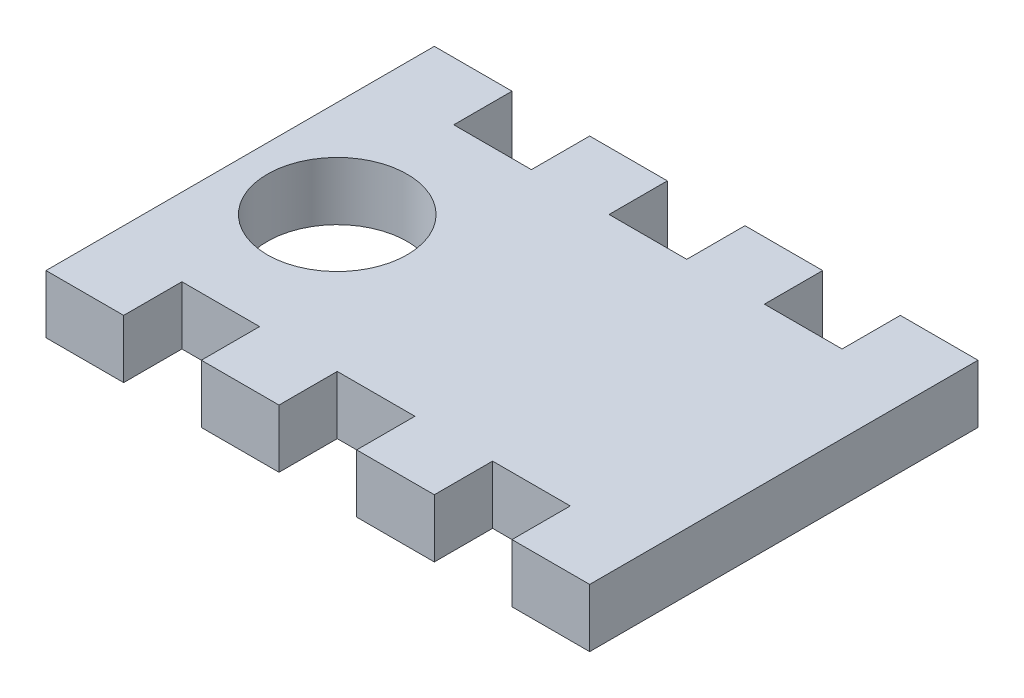
ISO-10303-21;
HEADER;
FILE_DESCRIPTION(('STEP AP214'),'2;1');
FILE_NAME('part.step','',(''),(''),'','','');
FILE_SCHEMA(('AUTOMOTIVE_DESIGN { 1 0 10303 214 1 1 1 1 }'));
ENDSEC;
DATA;
#1=APPLICATION_CONTEXT('core data for automotive mechanical design processes');
#2=APPLICATION_PROTOCOL_DEFINITION('international standard','automotive_design',2000,#1);
#3=PRODUCT_CONTEXT('',#1,'mechanical');
#4=PRODUCT('Part','Part','',(#3));
#5=PRODUCT_RELATED_PRODUCT_CATEGORY('part','',(#4));
#6=PRODUCT_DEFINITION_FORMATION('','',#4);
#7=PRODUCT_DEFINITION_CONTEXT('part definition',#1,'design');
#8=PRODUCT_DEFINITION('design','',#6,#7);
#9=PRODUCT_DEFINITION_SHAPE('','',#8);
#10=(LENGTH_UNIT() NAMED_UNIT(*) SI_UNIT(.MILLI.,.METRE.));
#11=(NAMED_UNIT(*) PLANE_ANGLE_UNIT() SI_UNIT($,.RADIAN.));
#12=(NAMED_UNIT(*) SI_UNIT($,.STERADIAN.) SOLID_ANGLE_UNIT());
#13=UNCERTAINTY_MEASURE_WITH_UNIT(LENGTH_MEASURE(1.E-05),#10,'distance_accuracy_value','');
#14=(GEOMETRIC_REPRESENTATION_CONTEXT(3) GLOBAL_UNCERTAINTY_ASSIGNED_CONTEXT((#13)) GLOBAL_UNIT_ASSIGNED_CONTEXT((#10,
#11,#12)) REPRESENTATION_CONTEXT('',''));
#15=CARTESIAN_POINT('',(0.,0.,0.));
#16=DIRECTION('',(0.,0.,1.));
#17=DIRECTION('',(1.,0.,0.));
#18=AXIS2_PLACEMENT_3D('',#15,#16,#17);
#19=CARTESIAN_POINT('',(0.,3.,7.));
#20=DIRECTION('',(0.,0.,-1.));
#21=DIRECTION('',(-1.,0.,0.));
#22=AXIS2_PLACEMENT_3D('',#19,#20,#21);
#23=PLANE('',#22);
#24=DIRECTION('',(1.,0.,0.));
#25=VECTOR('',#24,1.);
#26=CARTESIAN_POINT('',(0.,3.,7.));
#27=LINE('',#26,#25);
#28=CARTESIAN_POINT('',(-10.,3.,7.));
#29=VERTEX_POINT('',#28);
#30=CARTESIAN_POINT('',(-6.,3.,7.));
#31=VERTEX_POINT('',#30);
#32=EDGE_CURVE('E562',#29,#31,#27,.T.);
#33=ORIENTED_EDGE('',*,*,#32,.F.);
#34=DIRECTION('',(0.,-1.,0.));
#35=VECTOR('',#34,1.);
#36=CARTESIAN_POINT('',(-10.,3.,7.));
#37=LINE('',#36,#35);
#38=CARTESIAN_POINT('',(-10.,0.,7.));
#39=VERTEX_POINT('',#38);
#40=EDGE_CURVE('E12',#29,#39,#37,.T.);
#41=ORIENTED_EDGE('',*,*,#40,.T.);
#42=DIRECTION('',(1.,0.,0.));
#43=VECTOR('',#42,1.);
#44=CARTESIAN_POINT('',(0.,0.,7.));
#45=LINE('',#44,#43);
#46=CARTESIAN_POINT('',(-6.,0.,7.));
#47=VERTEX_POINT('',#46);
#48=EDGE_CURVE('E481',#39,#47,#45,.T.);
#49=ORIENTED_EDGE('',*,*,#48,.T.);
#50=DIRECTION('',(0.,-1.,0.));
#51=VECTOR('',#50,1.);
#52=CARTESIAN_POINT('',(-6.,3.,7.));
#53=LINE('',#52,#51);
#54=EDGE_CURVE('E328',#31,#47,#53,.T.);
#55=ORIENTED_EDGE('',*,*,#54,.F.);
#56=EDGE_LOOP('',(#33,#41,#49,#55));
#57=FACE_BOUND('',#56,.T.);
#58=ADVANCED_FACE('F201',(#57),#23,.F.);
#59=CARTESIAN_POINT('',(-6.00000000000001,3.,0.));
#60=DIRECTION('',(1.,0.,0.));
#61=DIRECTION('',(0.,0.,-1.));
#62=AXIS2_PLACEMENT_3D('',#59,#60,#61);
#63=PLANE('',#62);
#64=DIRECTION('',(0.,0.,1.));
#65=VECTOR('',#64,1.);
#66=CARTESIAN_POINT('',(-6.00000000000001,0.,0.));
#67=LINE('',#66,#65);
#68=CARTESIAN_POINT('',(-5.99999999999999,0.,10.));
#69=VERTEX_POINT('',#68);
#70=EDGE_CURVE('E477',#47,#69,#67,.T.);
#71=ORIENTED_EDGE('',*,*,#70,.T.);
#72=DIRECTION('',(0.,-1.,0.));
#73=VECTOR('',#72,1.);
#74=CARTESIAN_POINT('',(-5.99999999999999,3.,10.));
#75=LINE('',#74,#73);
#76=CARTESIAN_POINT('',(-5.99999999999999,3.,10.));
#77=VERTEX_POINT('',#76);
#78=EDGE_CURVE('E332',#77,#69,#75,.T.);
#79=ORIENTED_EDGE('',*,*,#78,.F.);
#80=DIRECTION('',(0.,0.,1.));
#81=VECTOR('',#80,1.);
#82=CARTESIAN_POINT('',(-6.00000000000001,3.,0.));
#83=LINE('',#82,#81);
#84=EDGE_CURVE('E558',#31,#77,#83,.T.);
#85=ORIENTED_EDGE('',*,*,#84,.F.);
#86=ORIENTED_EDGE('',*,*,#54,.T.);
#87=EDGE_LOOP('',(#71,#79,#85,#86));
#88=FACE_BOUND('',#87,.T.);
#89=ADVANCED_FACE('F647',(#88),#63,.F.);
#90=CARTESIAN_POINT('',(0.,3.,10.));
#91=DIRECTION('',(0.,0.,-1.));
#92=DIRECTION('',(-1.,0.,0.));
#93=AXIS2_PLACEMENT_3D('',#90,#91,#92);
#94=PLANE('',#93);
#95=DIRECTION('',(1.,0.,0.));
#96=VECTOR('',#95,1.);
#97=CARTESIAN_POINT('',(0.,0.,10.));
#98=LINE('',#97,#96);
#99=CARTESIAN_POINT('',(-1.99999999999999,0.,10.));
#100=VERTEX_POINT('',#99);
#101=EDGE_CURVE('E473',#69,#100,#98,.T.);
#102=ORIENTED_EDGE('',*,*,#101,.T.);
#103=DIRECTION('',(0.,-1.,0.));
#104=VECTOR('',#103,1.);
#105=CARTESIAN_POINT('',(-1.99999999999999,3.,10.));
#106=LINE('',#105,#104);
#107=CARTESIAN_POINT('',(-1.99999999999999,3.,10.));
#108=VERTEX_POINT('',#107);
#109=EDGE_CURVE('E336',#108,#100,#106,.T.);
#110=ORIENTED_EDGE('',*,*,#109,.F.);
#111=DIRECTION('',(1.,0.,0.));
#112=VECTOR('',#111,1.);
#113=CARTESIAN_POINT('',(0.,3.,10.));
#114=LINE('',#113,#112);
#115=EDGE_CURVE('E554',#77,#108,#114,.T.);
#116=ORIENTED_EDGE('',*,*,#115,.F.);
#117=ORIENTED_EDGE('',*,*,#78,.T.);
#118=EDGE_LOOP('',(#102,#110,#116,#117));
#119=FACE_BOUND('',#118,.T.);
#120=ADVANCED_FACE('F757',(#119),#94,.F.);
#121=CARTESIAN_POINT('',(-2.00000000000001,3.,0.));
#122=DIRECTION('',(1.,0.,0.));
#123=DIRECTION('',(0.,0.,-1.));
#124=AXIS2_PLACEMENT_3D('',#121,#122,#123);
#125=PLANE('',#124);
#126=DIRECTION('',(0.,0.,1.));
#127=VECTOR('',#126,1.);
#128=CARTESIAN_POINT('',(-2.00000000000001,0.,0.));
#129=LINE('',#128,#127);
#130=CARTESIAN_POINT('',(-2.,0.,7.));
#131=VERTEX_POINT('',#130);
#132=EDGE_CURVE('E469',#131,#100,#129,.T.);
#133=ORIENTED_EDGE('',*,*,#132,.F.);
#134=DIRECTION('',(0.,-1.,0.));
#135=VECTOR('',#134,1.);
#136=CARTESIAN_POINT('',(-2.,3.,7.));
#137=LINE('',#136,#135);
#138=CARTESIAN_POINT('',(-2.,3.,7.));
#139=VERTEX_POINT('',#138);
#140=EDGE_CURVE('E340',#139,#131,#137,.T.);
#141=ORIENTED_EDGE('',*,*,#140,.F.);
#142=DIRECTION('',(0.,0.,1.));
#143=VECTOR('',#142,1.);
#144=CARTESIAN_POINT('',(-2.00000000000001,3.,0.));
#145=LINE('',#144,#143);
#146=EDGE_CURVE('E550',#139,#108,#145,.T.);
#147=ORIENTED_EDGE('',*,*,#146,.T.);
#148=ORIENTED_EDGE('',*,*,#109,.T.);
#149=EDGE_LOOP('',(#133,#141,#147,#148));
#150=FACE_BOUND('',#149,.T.);
#151=ADVANCED_FACE('F760',(#150),#125,.T.);
#152=CARTESIAN_POINT('',(2.,0.,7.));
#153=VERTEX_POINT('',#152);
#154=EDGE_CURVE('E468',#131,#153,#45,.T.);
#155=ORIENTED_EDGE('',*,*,#154,.T.);
#156=DIRECTION('',(0.,-1.,0.));
#157=VECTOR('',#156,1.);
#158=CARTESIAN_POINT('',(2.,3.,7.));
#159=LINE('',#158,#157);
#160=CARTESIAN_POINT('',(2.,3.,7.));
#161=VERTEX_POINT('',#160);
#162=EDGE_CURVE('E344',#161,#153,#159,.T.);
#163=ORIENTED_EDGE('',*,*,#162,.F.);
#164=EDGE_CURVE('E549',#139,#161,#27,.T.);
#165=ORIENTED_EDGE('',*,*,#164,.F.);
#166=ORIENTED_EDGE('',*,*,#140,.T.);
#167=EDGE_LOOP('',(#155,#163,#165,#166));
#168=FACE_BOUND('',#167,.T.);
#169=ADVANCED_FACE('F764',(#168),#23,.F.);
#170=CARTESIAN_POINT('',(1.99999999999999,3.,0.));
#171=DIRECTION('',(1.,0.,0.));
#172=DIRECTION('',(0.,0.,-1.));
#173=AXIS2_PLACEMENT_3D('',#170,#171,#172);
#174=PLANE('',#173);
#175=DIRECTION('',(0.,0.,1.));
#176=VECTOR('',#175,1.);
#177=CARTESIAN_POINT('',(1.99999999999999,0.,0.));
#178=LINE('',#177,#176);
#179=CARTESIAN_POINT('',(2.00000000000001,0.,10.));
#180=VERTEX_POINT('',#179);
#181=EDGE_CURVE('E464',#153,#180,#178,.T.);
#182=ORIENTED_EDGE('',*,*,#181,.T.);
#183=DIRECTION('',(0.,-1.,0.));
#184=VECTOR('',#183,1.);
#185=CARTESIAN_POINT('',(2.00000000000001,3.,10.));
#186=LINE('',#185,#184);
#187=CARTESIAN_POINT('',(2.00000000000001,3.,10.));
#188=VERTEX_POINT('',#187);
#189=EDGE_CURVE('E348',#188,#180,#186,.T.);
#190=ORIENTED_EDGE('',*,*,#189,.F.);
#191=DIRECTION('',(0.,0.,1.));
#192=VECTOR('',#191,1.);
#193=CARTESIAN_POINT('',(1.99999999999999,3.,0.));
#194=LINE('',#193,#192);
#195=EDGE_CURVE('E545',#161,#188,#194,.T.);
#196=ORIENTED_EDGE('',*,*,#195,.F.);
#197=ORIENTED_EDGE('',*,*,#162,.T.);
#198=EDGE_LOOP('',(#182,#190,#196,#197));
#199=FACE_BOUND('',#198,.T.);
#200=ADVANCED_FACE('F766',(#199),#174,.F.);
#201=CARTESIAN_POINT('',(0.,3.,10.));
#202=DIRECTION('',(0.,0.,-1.));
#203=DIRECTION('',(-1.,0.,0.));
#204=AXIS2_PLACEMENT_3D('',#201,#202,#203);
#205=PLANE('',#204);
#206=DIRECTION('',(1.,0.,0.));
#207=VECTOR('',#206,1.);
#208=CARTESIAN_POINT('',(0.,0.,10.));
#209=LINE('',#208,#207);
#210=CARTESIAN_POINT('',(6.00000000000001,0.,10.));
#211=VERTEX_POINT('',#210);
#212=EDGE_CURVE('E460',#180,#211,#209,.T.);
#213=ORIENTED_EDGE('',*,*,#212,.T.);
#214=DIRECTION('',(0.,-1.,0.));
#215=VECTOR('',#214,1.);
#216=CARTESIAN_POINT('',(6.00000000000001,3.,10.));
#217=LINE('',#216,#215);
#218=CARTESIAN_POINT('',(6.00000000000001,3.,10.));
#219=VERTEX_POINT('',#218);
#220=EDGE_CURVE('E352',#219,#211,#217,.T.);
#221=ORIENTED_EDGE('',*,*,#220,.F.);
#222=DIRECTION('',(1.,0.,0.));
#223=VECTOR('',#222,1.);
#224=CARTESIAN_POINT('',(0.,3.,10.));
#225=LINE('',#224,#223);
#226=EDGE_CURVE('E541',#188,#219,#225,.T.);
#227=ORIENTED_EDGE('',*,*,#226,.F.);
#228=ORIENTED_EDGE('',*,*,#189,.T.);
#229=EDGE_LOOP('',(#213,#221,#227,#228));
#230=FACE_BOUND('',#229,.T.);
#231=ADVANCED_FACE('F769',(#230),#205,.F.);
#232=CARTESIAN_POINT('',(5.99999999999999,3.,0.));
#233=DIRECTION('',(1.,0.,0.));
#234=DIRECTION('',(0.,0.,-1.));
#235=AXIS2_PLACEMENT_3D('',#232,#233,#234);
#236=PLANE('',#235);
#237=DIRECTION('',(0.,0.,1.));
#238=VECTOR('',#237,1.);
#239=CARTESIAN_POINT('',(5.99999999999999,0.,0.));
#240=LINE('',#239,#238);
#241=CARTESIAN_POINT('',(6.,0.,7.));
#242=VERTEX_POINT('',#241);
#243=EDGE_CURVE('E456',#242,#211,#240,.T.);
#244=ORIENTED_EDGE('',*,*,#243,.F.);
#245=DIRECTION('',(0.,-1.,0.));
#246=VECTOR('',#245,1.);
#247=CARTESIAN_POINT('',(6.,3.,7.));
#248=LINE('',#247,#246);
#249=CARTESIAN_POINT('',(6.,3.,7.));
#250=VERTEX_POINT('',#249);
#251=EDGE_CURVE('E356',#250,#242,#248,.T.);
#252=ORIENTED_EDGE('',*,*,#251,.F.);
#253=DIRECTION('',(0.,0.,1.));
#254=VECTOR('',#253,1.);
#255=CARTESIAN_POINT('',(5.99999999999999,3.,0.));
#256=LINE('',#255,#254);
#257=EDGE_CURVE('E537',#250,#219,#256,.T.);
#258=ORIENTED_EDGE('',*,*,#257,.T.);
#259=ORIENTED_EDGE('',*,*,#220,.T.);
#260=EDGE_LOOP('',(#244,#252,#258,#259));
#261=FACE_BOUND('',#260,.T.);
#262=ADVANCED_FACE('F773',(#261),#236,.T.);
#263=CARTESIAN_POINT('',(10.,0.,7.));
#264=VERTEX_POINT('',#263);
#265=EDGE_CURVE('E455',#242,#264,#45,.T.);
#266=ORIENTED_EDGE('',*,*,#265,.T.);
#267=DIRECTION('',(0.,-1.,0.));
#268=VECTOR('',#267,1.);
#269=CARTESIAN_POINT('',(10.,3.,7.));
#270=LINE('',#269,#268);
#271=CARTESIAN_POINT('',(10.,3.,7.));
#272=VERTEX_POINT('',#271);
#273=EDGE_CURVE('E360',#272,#264,#270,.T.);
#274=ORIENTED_EDGE('',*,*,#273,.F.);
#275=EDGE_CURVE('E536',#250,#272,#27,.T.);
#276=ORIENTED_EDGE('',*,*,#275,.F.);
#277=ORIENTED_EDGE('',*,*,#251,.T.);
#278=EDGE_LOOP('',(#266,#274,#276,#277));
#279=FACE_BOUND('',#278,.T.);
#280=ADVANCED_FACE('F777',(#279),#23,.F.);
#281=CARTESIAN_POINT('',(9.99999999999999,3.,0.));
#282=DIRECTION('',(1.,0.,0.));
#283=DIRECTION('',(0.,0.,-1.));
#284=AXIS2_PLACEMENT_3D('',#281,#282,#283);
#285=PLANE('',#284);
#286=DIRECTION('',(0.,0.,1.));
#287=VECTOR('',#286,1.);
#288=CARTESIAN_POINT('',(9.99999999999999,0.,0.));
#289=LINE('',#288,#287);
#290=CARTESIAN_POINT('',(10.,0.,10.));
#291=VERTEX_POINT('',#290);
#292=EDGE_CURVE('E451',#264,#291,#289,.T.);
#293=ORIENTED_EDGE('',*,*,#292,.T.);
#294=DIRECTION('',(0.,-1.,0.));
#295=VECTOR('',#294,1.);
#296=CARTESIAN_POINT('',(10.,3.,10.));
#297=LINE('',#296,#295);
#298=CARTESIAN_POINT('',(10.,3.,10.));
#299=VERTEX_POINT('',#298);
#300=EDGE_CURVE('E364',#299,#291,#297,.T.);
#301=ORIENTED_EDGE('',*,*,#300,.F.);
#302=DIRECTION('',(0.,0.,1.));
#303=VECTOR('',#302,1.);
#304=CARTESIAN_POINT('',(9.99999999999999,3.,0.));
#305=LINE('',#304,#303);
#306=EDGE_CURVE('E532',#272,#299,#305,.T.);
#307=ORIENTED_EDGE('',*,*,#306,.F.);
#308=ORIENTED_EDGE('',*,*,#273,.T.);
#309=EDGE_LOOP('',(#293,#301,#307,#308));
#310=FACE_BOUND('',#309,.T.);
#311=ADVANCED_FACE('F781',(#310),#285,.F.);
#312=CARTESIAN_POINT('',(0.,3.,10.));
#313=DIRECTION('',(0.,0.,-1.));
#314=DIRECTION('',(-1.,0.,0.));
#315=AXIS2_PLACEMENT_3D('',#312,#313,#314);
#316=PLANE('',#315);
#317=DIRECTION('',(1.,0.,0.));
#318=VECTOR('',#317,1.);
#319=CARTESIAN_POINT('',(0.,0.,10.));
#320=LINE('',#319,#318);
#321=CARTESIAN_POINT('',(14.,0.,9.99999999999999));
#322=VERTEX_POINT('',#321);
#323=EDGE_CURVE('E447',#291,#322,#320,.T.);
#324=ORIENTED_EDGE('',*,*,#323,.T.);
#325=DIRECTION('',(0.,-1.,0.));
#326=VECTOR('',#325,1.);
#327=CARTESIAN_POINT('',(14.,3.,9.99999999999999));
#328=LINE('',#327,#326);
#329=CARTESIAN_POINT('',(14.,3.,9.99999999999999));
#330=VERTEX_POINT('',#329);
#331=EDGE_CURVE('E368',#330,#322,#328,.T.);
#332=ORIENTED_EDGE('',*,*,#331,.F.);
#333=DIRECTION('',(1.,0.,0.));
#334=VECTOR('',#333,1.);
#335=CARTESIAN_POINT('',(0.,3.,10.));
#336=LINE('',#335,#334);
#337=EDGE_CURVE('E528',#299,#330,#336,.T.);
#338=ORIENTED_EDGE('',*,*,#337,.F.);
#339=ORIENTED_EDGE('',*,*,#300,.T.);
#340=EDGE_LOOP('',(#324,#332,#338,#339));
#341=FACE_BOUND('',#340,.T.);
#342=ADVANCED_FACE('F785',(#341),#316,.F.);
#343=CARTESIAN_POINT('',(14.,3.,0.));
#344=DIRECTION('',(-1.,0.,0.));
#345=DIRECTION('',(0.,0.,1.));
#346=AXIS2_PLACEMENT_3D('',#343,#344,#345);
#347=PLANE('',#346);
#348=DIRECTION('',(0.,0.,-1.));
#349=VECTOR('',#348,1.);
#350=CARTESIAN_POINT('',(14.,0.,0.));
#351=LINE('',#350,#349);
#352=CARTESIAN_POINT('',(14.,0.,-10.));
#353=VERTEX_POINT('',#352);
#354=EDGE_CURVE('E443',#322,#353,#351,.T.);
#355=ORIENTED_EDGE('',*,*,#354,.T.);
#356=DIRECTION('',(0.,-1.,0.));
#357=VECTOR('',#356,1.);
#358=CARTESIAN_POINT('',(14.,3.,-10.));
#359=LINE('',#358,#357);
#360=CARTESIAN_POINT('',(14.,3.,-10.));
#361=VERTEX_POINT('',#360);
#362=EDGE_CURVE('E372',#361,#353,#359,.T.);
#363=ORIENTED_EDGE('',*,*,#362,.F.);
#364=DIRECTION('',(0.,0.,-1.));
#365=VECTOR('',#364,1.);
#366=CARTESIAN_POINT('',(14.,3.,0.));
#367=LINE('',#366,#365);
#368=EDGE_CURVE('E524',#330,#361,#367,.T.);
#369=ORIENTED_EDGE('',*,*,#368,.F.);
#370=ORIENTED_EDGE('',*,*,#331,.T.);
#371=EDGE_LOOP('',(#355,#363,#369,#370));
#372=FACE_BOUND('',#371,.T.);
#373=ADVANCED_FACE('F789',(#372),#347,.F.);
#374=CARTESIAN_POINT('',(0.,3.,-10.));
#375=DIRECTION('',(0.,0.,-1.));
#376=DIRECTION('',(-1.,0.,0.));
#377=AXIS2_PLACEMENT_3D('',#374,#375,#376);
#378=PLANE('',#377);
#379=DIRECTION('',(1.,0.,0.));
#380=VECTOR('',#379,1.);
#381=CARTESIAN_POINT('',(0.,0.,-10.));
#382=LINE('',#381,#380);
#383=CARTESIAN_POINT('',(9.99999999999999,0.,-10.));
#384=VERTEX_POINT('',#383);
#385=EDGE_CURVE('E439',#384,#353,#382,.T.);
#386=ORIENTED_EDGE('',*,*,#385,.F.);
#387=DIRECTION('',(0.,-1.,0.));
#388=VECTOR('',#387,1.);
#389=CARTESIAN_POINT('',(9.99999999999999,3.,-10.));
#390=LINE('',#389,#388);
#391=CARTESIAN_POINT('',(9.99999999999999,3.,-10.));
#392=VERTEX_POINT('',#391);
#393=EDGE_CURVE('E376',#392,#384,#390,.T.);
#394=ORIENTED_EDGE('',*,*,#393,.F.);
#395=DIRECTION('',(1.,0.,0.));
#396=VECTOR('',#395,1.);
#397=CARTESIAN_POINT('',(0.,3.,-10.));
#398=LINE('',#397,#396);
#399=EDGE_CURVE('E520',#392,#361,#398,.T.);
#400=ORIENTED_EDGE('',*,*,#399,.T.);
#401=ORIENTED_EDGE('',*,*,#362,.T.);
#402=EDGE_LOOP('',(#386,#394,#400,#401));
#403=FACE_BOUND('',#402,.T.);
#404=ADVANCED_FACE('F793',(#403),#378,.T.);
#405=CARTESIAN_POINT('',(9.99999999999999,3.,0.));
#406=DIRECTION('',(-1.,0.,0.));
#407=DIRECTION('',(0.,0.,1.));
#408=AXIS2_PLACEMENT_3D('',#405,#406,#407);
#409=PLANE('',#408);
#410=DIRECTION('',(0.,0.,-1.));
#411=VECTOR('',#410,1.);
#412=CARTESIAN_POINT('',(9.99999999999999,0.,0.));
#413=LINE('',#412,#411);
#414=CARTESIAN_POINT('',(9.99999999999999,0.,-7.));
#415=VERTEX_POINT('',#414);
#416=EDGE_CURVE('E435',#415,#384,#413,.T.);
#417=ORIENTED_EDGE('',*,*,#416,.F.);
#418=DIRECTION('',(0.,-1.,0.));
#419=VECTOR('',#418,1.);
#420=CARTESIAN_POINT('',(9.99999999999999,3.,-7.));
#421=LINE('',#420,#419);
#422=CARTESIAN_POINT('',(9.99999999999999,3.,-7.));
#423=VERTEX_POINT('',#422);
#424=EDGE_CURVE('E380',#423,#415,#421,.T.);
#425=ORIENTED_EDGE('',*,*,#424,.F.);
#426=DIRECTION('',(0.,0.,-1.));
#427=VECTOR('',#426,1.);
#428=CARTESIAN_POINT('',(9.99999999999999,3.,0.));
#429=LINE('',#428,#427);
#430=EDGE_CURVE('E516',#423,#392,#429,.T.);
#431=ORIENTED_EDGE('',*,*,#430,.T.);
#432=ORIENTED_EDGE('',*,*,#393,.T.);
#433=EDGE_LOOP('',(#417,#425,#431,#432));
#434=FACE_BOUND('',#433,.T.);
#435=ADVANCED_FACE('F797',(#434),#409,.T.);
#436=CARTESIAN_POINT('',(0.,3.,-7.));
#437=DIRECTION('',(0.,0.,-1.));
#438=DIRECTION('',(-1.,0.,0.));
#439=AXIS2_PLACEMENT_3D('',#436,#437,#438);
#440=PLANE('',#439);
#441=DIRECTION('',(1.,0.,0.));
#442=VECTOR('',#441,1.);
#443=CARTESIAN_POINT('',(0.,0.,-7.));
#444=LINE('',#443,#442);
#445=CARTESIAN_POINT('',(5.99999999999999,0.,-7.));
#446=VERTEX_POINT('',#445);
#447=EDGE_CURVE('E431',#446,#415,#444,.T.);
#448=ORIENTED_EDGE('',*,*,#447,.F.);
#449=DIRECTION('',(0.,-1.,0.));
#450=VECTOR('',#449,1.);
#451=CARTESIAN_POINT('',(5.99999999999999,3.,-7.));
#452=LINE('',#451,#450);
#453=CARTESIAN_POINT('',(5.99999999999999,3.,-7.));
#454=VERTEX_POINT('',#453);
#455=EDGE_CURVE('E384',#454,#446,#452,.T.);
#456=ORIENTED_EDGE('',*,*,#455,.F.);
#457=DIRECTION('',(1.,0.,0.));
#458=VECTOR('',#457,1.);
#459=CARTESIAN_POINT('',(0.,3.,-7.));
#460=LINE('',#459,#458);
#461=EDGE_CURVE('E512',#454,#423,#460,.T.);
#462=ORIENTED_EDGE('',*,*,#461,.T.);
#463=ORIENTED_EDGE('',*,*,#424,.T.);
#464=EDGE_LOOP('',(#448,#456,#462,#463));
#465=FACE_BOUND('',#464,.T.);
#466=ADVANCED_FACE('F801',(#465),#440,.T.);
#467=CARTESIAN_POINT('',(5.99999999999999,3.,0.));
#468=DIRECTION('',(-1.,0.,0.));
#469=DIRECTION('',(0.,0.,1.));
#470=AXIS2_PLACEMENT_3D('',#467,#468,#469);
#471=PLANE('',#470);
#472=DIRECTION('',(0.,0.,-1.));
#473=VECTOR('',#472,1.);
#474=CARTESIAN_POINT('',(5.99999999999999,0.,0.));
#475=LINE('',#474,#473);
#476=CARTESIAN_POINT('',(5.99999999999999,0.,-10.));
#477=VERTEX_POINT('',#476);
#478=EDGE_CURVE('E427',#446,#477,#475,.T.);
#479=ORIENTED_EDGE('',*,*,#478,.T.);
#480=DIRECTION('',(0.,-1.,0.));
#481=VECTOR('',#480,1.);
#482=CARTESIAN_POINT('',(5.99999999999999,3.,-10.));
#483=LINE('',#482,#481);
#484=CARTESIAN_POINT('',(5.99999999999999,3.,-10.));
#485=VERTEX_POINT('',#484);
#486=EDGE_CURVE('E388',#485,#477,#483,.T.);
#487=ORIENTED_EDGE('',*,*,#486,.F.);
#488=DIRECTION('',(0.,0.,-1.));
#489=VECTOR('',#488,1.);
#490=CARTESIAN_POINT('',(5.99999999999999,3.,0.));
#491=LINE('',#490,#489);
#492=EDGE_CURVE('E508',#454,#485,#491,.T.);
#493=ORIENTED_EDGE('',*,*,#492,.F.);
#494=ORIENTED_EDGE('',*,*,#455,.T.);
#495=EDGE_LOOP('',(#479,#487,#493,#494));
#496=FACE_BOUND('',#495,.T.);
#497=ADVANCED_FACE('F803',(#496),#471,.F.);
#498=CARTESIAN_POINT('',(0.,3.,-10.));
#499=DIRECTION('',(0.,0.,-1.));
#500=DIRECTION('',(-1.,0.,0.));
#501=AXIS2_PLACEMENT_3D('',#498,#499,#500);
#502=PLANE('',#501);
#503=DIRECTION('',(1.,0.,0.));
#504=VECTOR('',#503,1.);
#505=CARTESIAN_POINT('',(0.,0.,-10.));
#506=LINE('',#505,#504);
#507=CARTESIAN_POINT('',(1.99999999999999,0.,-10.));
#508=VERTEX_POINT('',#507);
#509=EDGE_CURVE('E423',#508,#477,#506,.T.);
#510=ORIENTED_EDGE('',*,*,#509,.F.);
#511=DIRECTION('',(0.,-1.,0.));
#512=VECTOR('',#511,1.);
#513=CARTESIAN_POINT('',(1.99999999999999,3.,-10.));
#514=LINE('',#513,#512);
#515=CARTESIAN_POINT('',(1.99999999999999,3.,-10.));
#516=VERTEX_POINT('',#515);
#517=EDGE_CURVE('E392',#516,#508,#514,.T.);
#518=ORIENTED_EDGE('',*,*,#517,.F.);
#519=DIRECTION('',(1.,0.,0.));
#520=VECTOR('',#519,1.);
#521=CARTESIAN_POINT('',(0.,3.,-10.));
#522=LINE('',#521,#520);
#523=EDGE_CURVE('E504',#516,#485,#522,.T.);
#524=ORIENTED_EDGE('',*,*,#523,.T.);
#525=ORIENTED_EDGE('',*,*,#486,.T.);
#526=EDGE_LOOP('',(#510,#518,#524,#525));
#527=FACE_BOUND('',#526,.T.);
#528=ADVANCED_FACE('F722',(#527),#502,.T.);
#529=CARTESIAN_POINT('',(1.99999999999999,3.,0.));
#530=DIRECTION('',(-1.,0.,0.));
#531=DIRECTION('',(0.,0.,1.));
#532=AXIS2_PLACEMENT_3D('',#529,#530,#531);
#533=PLANE('',#532);
#534=DIRECTION('',(0.,0.,-1.));
#535=VECTOR('',#534,1.);
#536=CARTESIAN_POINT('',(1.99999999999999,0.,0.));
#537=LINE('',#536,#535);
#538=CARTESIAN_POINT('',(1.99999999999999,0.,-7.));
#539=VERTEX_POINT('',#538);
#540=EDGE_CURVE('E418',#539,#508,#537,.T.);
#541=ORIENTED_EDGE('',*,*,#540,.F.);
#542=DIRECTION('',(0.,-1.,0.));
#543=VECTOR('',#542,1.);
#544=CARTESIAN_POINT('',(1.99999999999999,3.,-7.));
#545=LINE('',#544,#543);
#546=CARTESIAN_POINT('',(1.99999999999999,3.,-7.));
#547=VERTEX_POINT('',#546);
#548=EDGE_CURVE('E396',#547,#539,#545,.T.);
#549=ORIENTED_EDGE('',*,*,#548,.F.);
#550=DIRECTION('',(0.,0.,-1.));
#551=VECTOR('',#550,1.);
#552=CARTESIAN_POINT('',(1.99999999999999,3.,0.));
#553=LINE('',#552,#551);
#554=EDGE_CURVE('E499',#547,#516,#553,.T.);
#555=ORIENTED_EDGE('',*,*,#554,.T.);
#556=ORIENTED_EDGE('',*,*,#517,.T.);
#557=EDGE_LOOP('',(#541,#549,#555,#556));
#558=FACE_BOUND('',#557,.T.);
#559=ADVANCED_FACE('F715',(#558),#533,.T.);
#560=CARTESIAN_POINT('',(-2.00000000000001,0.,-7.));
#561=VERTEX_POINT('',#560);
#562=EDGE_CURVE('E422',#561,#539,#444,.T.);
#563=ORIENTED_EDGE('',*,*,#562,.F.);
#564=DIRECTION('',(0.,1.,0.));
#565=VECTOR('',#564,1.);
#566=CARTESIAN_POINT('',(-2.00000000000001,3.,-7.));
#567=LINE('',#566,#565);
#568=CARTESIAN_POINT('',(-2.00000000000001,3.,-7.));
#569=VERTEX_POINT('',#568);
#570=EDGE_CURVE('E212',#561,#569,#567,.T.);
#571=ORIENTED_EDGE('',*,*,#570,.T.);
#572=EDGE_CURVE('E503',#569,#547,#460,.T.);
#573=ORIENTED_EDGE('',*,*,#572,.T.);
#574=ORIENTED_EDGE('',*,*,#548,.T.);
#575=EDGE_LOOP('',(#563,#571,#573,#574));
#576=FACE_BOUND('',#575,.T.);
#577=ADVANCED_FACE('F711',(#576),#440,.T.);
#578=DIRECTION('',(0.,1.,0.));
#579=VECTOR('',#578,1.);
#580=CARTESIAN_POINT('',(-6.00000000000001,3.,-7.));
#581=LINE('',#580,#579);
#582=CARTESIAN_POINT('',(-6.00000000000001,0.,-7.));
#583=VERTEX_POINT('',#582);
#584=CARTESIAN_POINT('',(-6.00000000000001,3.,-7.));
#585=VERTEX_POINT('',#584);
#586=EDGE_CURVE('E325',#583,#585,#581,.T.);
#587=ORIENTED_EDGE('',*,*,#586,.F.);
#588=CARTESIAN_POINT('',(-10.,0.,-7.));
#589=VERTEX_POINT('',#588);
#590=EDGE_CURVE('E417',#589,#583,#444,.T.);
#591=ORIENTED_EDGE('',*,*,#590,.F.);
#592=DIRECTION('',(0.,-1.,0.));
#593=VECTOR('',#592,1.);
#594=CARTESIAN_POINT('',(-10.,3.,-7.));
#595=LINE('',#594,#593);
#596=CARTESIAN_POINT('',(-10.,3.,-7.));
#597=VERTEX_POINT('',#596);
#598=EDGE_CURVE('E400',#597,#589,#595,.T.);
#599=ORIENTED_EDGE('',*,*,#598,.F.);
#600=EDGE_CURVE('E498',#597,#585,#460,.T.);
#601=ORIENTED_EDGE('',*,*,#600,.T.);
#602=EDGE_LOOP('',(#587,#591,#599,#601));
#603=FACE_BOUND('',#602,.T.);
#604=ADVANCED_FACE('F698',(#603),#440,.T.);
#605=CARTESIAN_POINT('',(-10.,3.,0.));
#606=DIRECTION('',(-1.,0.,0.));
#607=DIRECTION('',(0.,0.,1.));
#608=AXIS2_PLACEMENT_3D('',#605,#606,#607);
#609=PLANE('',#608);
#610=DIRECTION('',(0.,0.,-1.));
#611=VECTOR('',#610,1.);
#612=CARTESIAN_POINT('',(-10.,0.,0.));
#613=LINE('',#612,#611);
#614=CARTESIAN_POINT('',(-10.,0.,-10.));
#615=VERTEX_POINT('',#614);
#616=EDGE_CURVE('E413',#589,#615,#613,.T.);
#617=ORIENTED_EDGE('',*,*,#616,.T.);
#618=DIRECTION('',(0.,-1.,0.));
#619=VECTOR('',#618,1.);
#620=CARTESIAN_POINT('',(-10.,3.,-10.));
#621=LINE('',#620,#619);
#622=CARTESIAN_POINT('',(-10.,3.,-10.));
#623=VERTEX_POINT('',#622);
#624=EDGE_CURVE('E404',#623,#615,#621,.T.);
#625=ORIENTED_EDGE('',*,*,#624,.F.);
#626=DIRECTION('',(0.,0.,-1.));
#627=VECTOR('',#626,1.);
#628=CARTESIAN_POINT('',(-10.,3.,0.));
#629=LINE('',#628,#627);
#630=EDGE_CURVE('E494',#597,#623,#629,.T.);
#631=ORIENTED_EDGE('',*,*,#630,.F.);
#632=ORIENTED_EDGE('',*,*,#598,.T.);
#633=EDGE_LOOP('',(#617,#625,#631,#632));
#634=FACE_BOUND('',#633,.T.);
#635=ADVANCED_FACE('F704',(#634),#609,.F.);
#636=CARTESIAN_POINT('',(0.,3.,-9.99999999999999));
#637=DIRECTION('',(0.,0.,-1.));
#638=DIRECTION('',(-1.,0.,0.));
#639=AXIS2_PLACEMENT_3D('',#636,#637,#638);
#640=PLANE('',#639);
#641=DIRECTION('',(1.,0.,0.));
#642=VECTOR('',#641,1.);
#643=CARTESIAN_POINT('',(0.,0.,-9.99999999999999));
#644=LINE('',#643,#642);
#645=CARTESIAN_POINT('',(-14.,0.,-10.));
#646=VERTEX_POINT('',#645);
#647=EDGE_CURVE('E272',#646,#615,#644,.T.);
#648=ORIENTED_EDGE('',*,*,#647,.F.);
#649=DIRECTION('',(0.,-1.,0.));
#650=VECTOR('',#649,1.);
#651=CARTESIAN_POINT('',(-14.,3.,-10.));
#652=LINE('',#651,#650);
#653=CARTESIAN_POINT('',(-14.,3.,-10.));
#654=VERTEX_POINT('',#653);
#655=EDGE_CURVE('E265',#654,#646,#652,.T.);
#656=ORIENTED_EDGE('',*,*,#655,.F.);
#657=DIRECTION('',(1.,0.,0.));
#658=VECTOR('',#657,1.);
#659=CARTESIAN_POINT('',(0.,3.,-9.99999999999999));
#660=LINE('',#659,#658);
#661=EDGE_CURVE('E490',#654,#623,#660,.T.);
#662=ORIENTED_EDGE('',*,*,#661,.T.);
#663=ORIENTED_EDGE('',*,*,#624,.T.);
#664=EDGE_LOOP('',(#648,#656,#662,#663));
#665=FACE_BOUND('',#664,.T.);
#666=ADVANCED_FACE('F728',(#665),#640,.T.);
#667=CARTESIAN_POINT('',(-14.,3.,0.));
#668=DIRECTION('',(-1.,0.,0.));
#669=DIRECTION('',(0.,0.,1.));
#670=AXIS2_PLACEMENT_3D('',#667,#668,#669);
#671=PLANE('',#670);
#672=DIRECTION('',(0.,0.,-1.));
#673=VECTOR('',#672,1.);
#674=CARTESIAN_POINT('',(-14.,0.,0.));
#675=LINE('',#674,#673);
#676=CARTESIAN_POINT('',(-14.,0.,10.));
#677=VERTEX_POINT('',#676);
#678=EDGE_CURVE('E257',#677,#646,#675,.T.);
#679=ORIENTED_EDGE('',*,*,#678,.F.);
#680=DIRECTION('',(0.,-1.,0.));
#681=VECTOR('',#680,1.);
#682=CARTESIAN_POINT('',(-14.,3.,10.));
#683=LINE('',#682,#681);
#684=CARTESIAN_POINT('',(-14.,3.,10.));
#685=VERTEX_POINT('',#684);
#686=EDGE_CURVE('E261',#685,#677,#683,.T.);
#687=ORIENTED_EDGE('',*,*,#686,.F.);
#688=DIRECTION('',(0.,0.,-1.));
#689=VECTOR('',#688,1.);
#690=CARTESIAN_POINT('',(-14.,3.,0.));
#691=LINE('',#690,#689);
#692=EDGE_CURVE('E409',#685,#654,#691,.T.);
#693=ORIENTED_EDGE('',*,*,#692,.T.);
#694=ORIENTED_EDGE('',*,*,#655,.T.);
#695=EDGE_LOOP('',(#679,#687,#693,#694));
#696=FACE_BOUND('',#695,.T.);
#697=ADVANCED_FACE('F259',(#696),#671,.T.);
#698=CARTESIAN_POINT('',(-9.00000000000001,3.,0.));
#699=DIRECTION('',(0.,-1.,0.));
#700=DIRECTION('',(0.,0.,-1.));
#701=AXIS2_PLACEMENT_3D('',#698,#699,#700);
#702=CYLINDRICAL_SURFACE('',#701,3.6);
#703=CARTESIAN_POINT('',(-9.00000000000001,3.,0.));
#704=DIRECTION('',(0.,1.,0.));
#705=DIRECTION('',(0.,0.,1.));
#706=AXIS2_PLACEMENT_3D('',#703,#704,#705);
#707=CIRCLE('',#706,3.6);
#708=CARTESIAN_POINT('',(-9.00000000000001,3.,3.6));
#709=VERTEX_POINT('',#708);
#710=EDGE_CURVE('E271',#709,#709,#707,.T.);
#711=ORIENTED_EDGE('',*,*,#710,.T.);
#712=EDGE_LOOP('',(#711));
#713=FACE_BOUND('',#712,.T.);
#714=CARTESIAN_POINT('',(-9.00000000000001,0.,0.));
#715=DIRECTION('',(0.,1.,0.));
#716=DIRECTION('',(0.,0.,1.));
#717=AXIS2_PLACEMENT_3D('',#714,#715,#716);
#718=CIRCLE('',#717,3.6);
#719=CARTESIAN_POINT('',(-9.00000000000001,0.,3.6));
#720=VERTEX_POINT('',#719);
#721=EDGE_CURVE('E297',#720,#720,#718,.T.);
#722=ORIENTED_EDGE('',*,*,#721,.F.);
#723=EDGE_LOOP('',(#722));
#724=FACE_BOUND('',#723,.T.);
#725=ADVANCED_FACE('F570',(#713,#724),#702,.F.);
#726=CARTESIAN_POINT('',(0.,0.,0.));
#727=DIRECTION('',(0.,1.,0.));
#728=DIRECTION('',(0.,0.,1.));
#729=AXIS2_PLACEMENT_3D('',#726,#727,#728);
#730=PLANE('',#729);
#731=ORIENTED_EDGE('',*,*,#721,.T.);
#732=EDGE_LOOP('',(#731));
#733=FACE_BOUND('',#732,.T.);
#734=ORIENTED_EDGE('',*,*,#48,.F.);
#735=DIRECTION('',(0.,0.,1.));
#736=VECTOR('',#735,1.);
#737=CARTESIAN_POINT('',(-10.,0.,7.00000000000002));
#738=LINE('',#737,#736);
#739=CARTESIAN_POINT('',(-10.,0.,10.));
#740=VERTEX_POINT('',#739);
#741=EDGE_CURVE('E283',#39,#740,#738,.T.);
#742=ORIENTED_EDGE('',*,*,#741,.T.);
#743=DIRECTION('',(1.,0.,0.));
#744=VECTOR('',#743,1.);
#745=CARTESIAN_POINT('',(-14.,0.,10.));
#746=LINE('',#745,#744);
#747=EDGE_CURVE('E276',#677,#740,#746,.T.);
#748=ORIENTED_EDGE('',*,*,#747,.F.);
#749=ORIENTED_EDGE('',*,*,#678,.T.);
#750=ORIENTED_EDGE('',*,*,#647,.T.);
#751=ORIENTED_EDGE('',*,*,#616,.F.);
#752=ORIENTED_EDGE('',*,*,#590,.T.);
#753=DIRECTION('',(0.,0.,-1.));
#754=VECTOR('',#753,1.);
#755=CARTESIAN_POINT('',(-6.00000000000001,0.,-7.));
#756=LINE('',#755,#754);
#757=CARTESIAN_POINT('',(-6.00000000000001,0.,-10.));
#758=VERTEX_POINT('',#757);
#759=EDGE_CURVE('E302',#583,#758,#756,.T.);
#760=ORIENTED_EDGE('',*,*,#759,.T.);
#761=DIRECTION('',(1.,0.,0.));
#762=VECTOR('',#761,1.);
#763=CARTESIAN_POINT('',(-6.00000000000001,0.,-10.));
#764=LINE('',#763,#762);
#765=CARTESIAN_POINT('',(-2.00000000000001,0.,-10.));
#766=VERTEX_POINT('',#765);
#767=EDGE_CURVE('E307',#758,#766,#764,.T.);
#768=ORIENTED_EDGE('',*,*,#767,.T.);
#769=DIRECTION('',(0.,0.,-1.));
#770=VECTOR('',#769,1.);
#771=CARTESIAN_POINT('',(-2.00000000000001,0.,-7.));
#772=LINE('',#771,#770);
#773=EDGE_CURVE('E280',#561,#766,#772,.T.);
#774=ORIENTED_EDGE('',*,*,#773,.F.);
#775=ORIENTED_EDGE('',*,*,#562,.T.);
#776=ORIENTED_EDGE('',*,*,#540,.T.);
#777=ORIENTED_EDGE('',*,*,#509,.T.);
#778=ORIENTED_EDGE('',*,*,#478,.F.);
#779=ORIENTED_EDGE('',*,*,#447,.T.);
#780=ORIENTED_EDGE('',*,*,#416,.T.);
#781=ORIENTED_EDGE('',*,*,#385,.T.);
#782=ORIENTED_EDGE('',*,*,#354,.F.);
#783=ORIENTED_EDGE('',*,*,#323,.F.);
#784=ORIENTED_EDGE('',*,*,#292,.F.);
#785=ORIENTED_EDGE('',*,*,#265,.F.);
#786=ORIENTED_EDGE('',*,*,#243,.T.);
#787=ORIENTED_EDGE('',*,*,#212,.F.);
#788=ORIENTED_EDGE('',*,*,#181,.F.);
#789=ORIENTED_EDGE('',*,*,#154,.F.);
#790=ORIENTED_EDGE('',*,*,#132,.T.);
#791=ORIENTED_EDGE('',*,*,#101,.F.);
#792=ORIENTED_EDGE('',*,*,#70,.F.);
#793=EDGE_LOOP('',(#734,#742,#748,#749,#750,#751,#752,#760,#768,#774,#775,#776,#777,#778,#779,
#780,#781,#782,#783,#784,#785,#786,#787,#788,#789,#790,#791,#792));
#794=FACE_BOUND('',#793,.T.);
#795=ADVANCED_FACE('F282',(#733,#794),#730,.F.);
#796=CARTESIAN_POINT('',(0.,3.,0.));
#797=DIRECTION('',(0.,1.,0.));
#798=DIRECTION('',(0.,0.,1.));
#799=AXIS2_PLACEMENT_3D('',#796,#797,#798);
#800=PLANE('',#799);
#801=ORIENTED_EDGE('',*,*,#710,.F.);
#802=EDGE_LOOP('',(#801));
#803=FACE_BOUND('',#802,.T.);
#804=ORIENTED_EDGE('',*,*,#692,.F.);
#805=DIRECTION('',(1.,0.,0.));
#806=VECTOR('',#805,1.);
#807=CARTESIAN_POINT('',(-14.,3.,10.));
#808=LINE('',#807,#806);
#809=CARTESIAN_POINT('',(-10.,3.,10.));
#810=VERTEX_POINT('',#809);
#811=EDGE_CURVE('E278',#685,#810,#808,.T.);
#812=ORIENTED_EDGE('',*,*,#811,.T.);
#813=DIRECTION('',(0.,0.,1.));
#814=VECTOR('',#813,1.);
#815=CARTESIAN_POINT('',(-10.,3.,7.00000000000002));
#816=LINE('',#815,#814);
#817=EDGE_CURVE('E285',#29,#810,#816,.T.);
#818=ORIENTED_EDGE('',*,*,#817,.F.);
#819=ORIENTED_EDGE('',*,*,#32,.T.);
#820=ORIENTED_EDGE('',*,*,#84,.T.);
#821=ORIENTED_EDGE('',*,*,#115,.T.);
#822=ORIENTED_EDGE('',*,*,#146,.F.);
#823=ORIENTED_EDGE('',*,*,#164,.T.);
#824=ORIENTED_EDGE('',*,*,#195,.T.);
#825=ORIENTED_EDGE('',*,*,#226,.T.);
#826=ORIENTED_EDGE('',*,*,#257,.F.);
#827=ORIENTED_EDGE('',*,*,#275,.T.);
#828=ORIENTED_EDGE('',*,*,#306,.T.);
#829=ORIENTED_EDGE('',*,*,#337,.T.);
#830=ORIENTED_EDGE('',*,*,#368,.T.);
#831=ORIENTED_EDGE('',*,*,#399,.F.);
#832=ORIENTED_EDGE('',*,*,#430,.F.);
#833=ORIENTED_EDGE('',*,*,#461,.F.);
#834=ORIENTED_EDGE('',*,*,#492,.T.);
#835=ORIENTED_EDGE('',*,*,#523,.F.);
#836=ORIENTED_EDGE('',*,*,#554,.F.);
#837=ORIENTED_EDGE('',*,*,#572,.F.);
#838=DIRECTION('',(0.,0.,-1.));
#839=VECTOR('',#838,1.);
#840=CARTESIAN_POINT('',(-2.00000000000001,3.,-7.));
#841=LINE('',#840,#839);
#842=CARTESIAN_POINT('',(-2.00000000000001,3.,-10.));
#843=VERTEX_POINT('',#842);
#844=EDGE_CURVE('E306',#569,#843,#841,.T.);
#845=ORIENTED_EDGE('',*,*,#844,.T.);
#846=DIRECTION('',(1.,0.,0.));
#847=VECTOR('',#846,1.);
#848=CARTESIAN_POINT('',(-6.00000000000001,3.,-10.));
#849=LINE('',#848,#847);
#850=CARTESIAN_POINT('',(-6.00000000000001,3.,-10.));
#851=VERTEX_POINT('',#850);
#852=EDGE_CURVE('E317',#851,#843,#849,.T.);
#853=ORIENTED_EDGE('',*,*,#852,.F.);
#854=DIRECTION('',(0.,0.,-1.));
#855=VECTOR('',#854,1.);
#856=CARTESIAN_POINT('',(-6.00000000000001,3.,-7.));
#857=LINE('',#856,#855);
#858=EDGE_CURVE('E301',#585,#851,#857,.T.);
#859=ORIENTED_EDGE('',*,*,#858,.F.);
#860=ORIENTED_EDGE('',*,*,#600,.F.);
#861=ORIENTED_EDGE('',*,*,#630,.T.);
#862=ORIENTED_EDGE('',*,*,#661,.F.);
#863=EDGE_LOOP('',(#804,#812,#818,#819,#820,#821,#822,#823,#824,#825,#826,#827,#828,#829,#830,
#831,#832,#833,#834,#835,#836,#837,#845,#853,#859,#860,#861,#862));
#864=FACE_BOUND('',#863,.T.);
#865=ADVANCED_FACE('F573',(#803,#864),#800,.T.);
#866=CARTESIAN_POINT('',(-14.,3.,10.));
#867=DIRECTION('',(0.,0.,-1.));
#868=DIRECTION('',(-1.,0.,0.));
#869=AXIS2_PLACEMENT_3D('',#866,#867,#868);
#870=PLANE('',#869);
#871=ORIENTED_EDGE('',*,*,#747,.T.);
#872=DIRECTION('',(0.,-1.,0.));
#873=VECTOR('',#872,1.);
#874=CARTESIAN_POINT('',(-10.,3.,10.));
#875=LINE('',#874,#873);
#876=EDGE_CURVE('E205',#810,#740,#875,.T.);
#877=ORIENTED_EDGE('',*,*,#876,.F.);
#878=ORIENTED_EDGE('',*,*,#811,.F.);
#879=ORIENTED_EDGE('',*,*,#686,.T.);
#880=EDGE_LOOP('',(#871,#877,#878,#879));
#881=FACE_BOUND('',#880,.T.);
#882=ADVANCED_FACE('F275',(#881),#870,.F.);
#883=CARTESIAN_POINT('',(-10.,3.,7.00000000000002));
#884=DIRECTION('',(1.,0.,0.));
#885=DIRECTION('',(0.,0.,-1.));
#886=AXIS2_PLACEMENT_3D('',#883,#884,#885);
#887=PLANE('',#886);
#888=ORIENTED_EDGE('',*,*,#741,.F.);
#889=ORIENTED_EDGE('',*,*,#40,.F.);
#890=ORIENTED_EDGE('',*,*,#817,.T.);
#891=ORIENTED_EDGE('',*,*,#876,.T.);
#892=EDGE_LOOP('',(#888,#889,#890,#891));
#893=FACE_BOUND('',#892,.T.);
#894=ADVANCED_FACE('F203',(#893),#887,.T.);
#895=CARTESIAN_POINT('',(-2.00000000000001,3.,-7.));
#896=DIRECTION('',(-1.,0.,0.));
#897=DIRECTION('',(0.,0.,1.));
#898=AXIS2_PLACEMENT_3D('',#895,#896,#897);
#899=PLANE('',#898);
#900=ORIENTED_EDGE('',*,*,#773,.T.);
#901=DIRECTION('',(0.,-1.,0.));
#902=VECTOR('',#901,1.);
#903=CARTESIAN_POINT('',(-2.00000000000001,3.,-10.));
#904=LINE('',#903,#902);
#905=EDGE_CURVE('E294',#843,#766,#904,.T.);
#906=ORIENTED_EDGE('',*,*,#905,.F.);
#907=ORIENTED_EDGE('',*,*,#844,.F.);
#908=ORIENTED_EDGE('',*,*,#570,.F.);
#909=EDGE_LOOP('',(#900,#906,#907,#908));
#910=FACE_BOUND('',#909,.T.);
#911=ADVANCED_FACE('F577',(#910),#899,.F.);
#912=CARTESIAN_POINT('',(-6.00000000000001,3.,-10.));
#913=DIRECTION('',(0.,0.,-1.));
#914=DIRECTION('',(-1.,0.,0.));
#915=AXIS2_PLACEMENT_3D('',#912,#913,#914);
#916=PLANE('',#915);
#917=ORIENTED_EDGE('',*,*,#767,.F.);
#918=DIRECTION('',(0.,-1.,0.));
#919=VECTOR('',#918,1.);
#920=CARTESIAN_POINT('',(-6.00000000000001,3.,-10.));
#921=LINE('',#920,#919);
#922=EDGE_CURVE('E298',#851,#758,#921,.T.);
#923=ORIENTED_EDGE('',*,*,#922,.F.);
#924=ORIENTED_EDGE('',*,*,#852,.T.);
#925=ORIENTED_EDGE('',*,*,#905,.T.);
#926=EDGE_LOOP('',(#917,#923,#924,#925));
#927=FACE_BOUND('',#926,.T.);
#928=ADVANCED_FACE('F744',(#927),#916,.T.);
#929=CARTESIAN_POINT('',(-6.00000000000001,3.,-7.));
#930=DIRECTION('',(-1.,0.,0.));
#931=DIRECTION('',(0.,0.,1.));
#932=AXIS2_PLACEMENT_3D('',#929,#930,#931);
#933=PLANE('',#932);
#934=ORIENTED_EDGE('',*,*,#759,.F.);
#935=ORIENTED_EDGE('',*,*,#586,.T.);
#936=ORIENTED_EDGE('',*,*,#858,.T.);
#937=ORIENTED_EDGE('',*,*,#922,.T.);
#938=EDGE_LOOP('',(#934,#935,#936,#937));
#939=FACE_BOUND('',#938,.T.);
#940=ADVANCED_FACE('F748',(#939),#933,.T.);
#941=CLOSED_SHELL('',(#58,#89,#120,#151,#169,#200,#231,#262,#280,#311,#342,#373,#404,#435,#466,
#497,#528,#559,#577,#604,#635,#666,#697,#725,#795,#865,#882,#894,#911,#928,#940));
#942=MANIFOLD_SOLID_BREP('B2',#941);
#943=ADVANCED_BREP_SHAPE_REPRESENTATION('',(#18,#942),#14);
#944=SHAPE_DEFINITION_REPRESENTATION(#9,#943);
ENDSEC;
END-ISO-10303-21;
